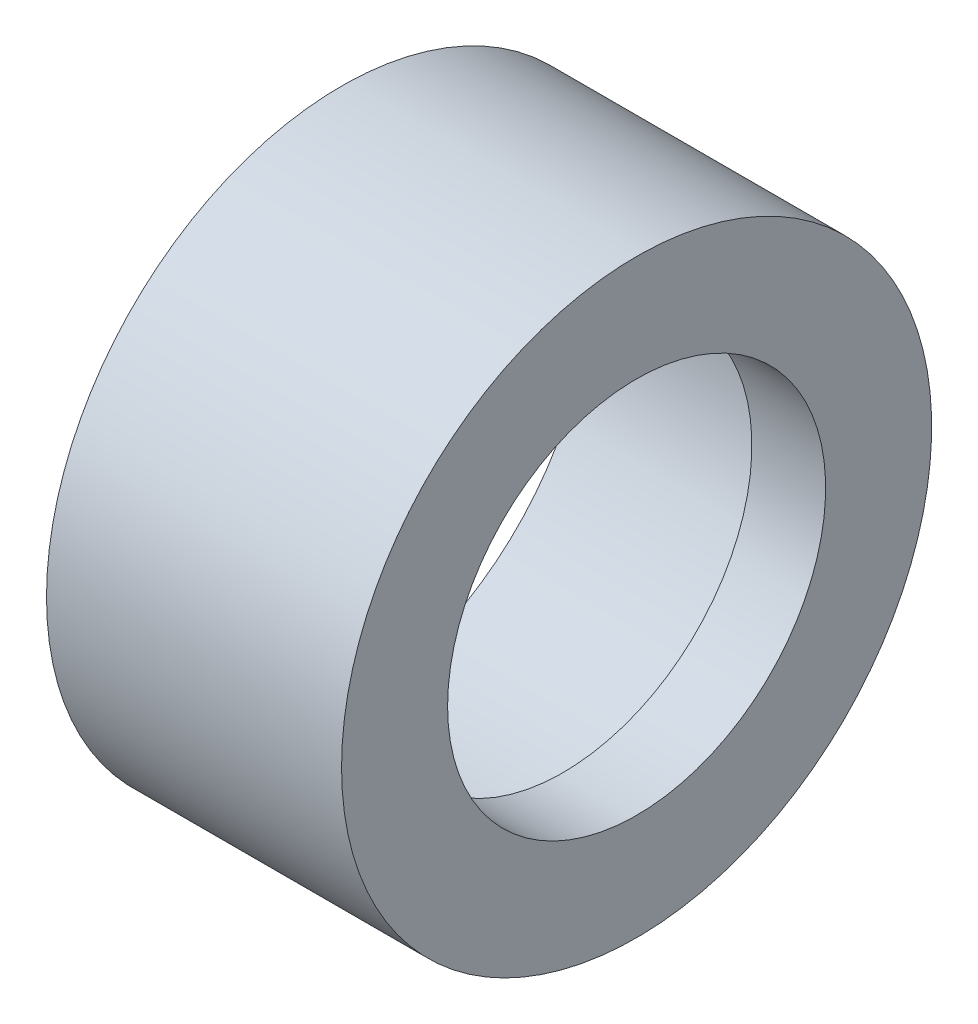
ISO-10303-21;
HEADER;
FILE_DESCRIPTION(('STEP AP214'),'2;1');
FILE_NAME('part.step','',(''),(''),'','','');
FILE_SCHEMA(('AUTOMOTIVE_DESIGN { 1 0 10303 214 1 1 1 1 }'));
ENDSEC;
DATA;
#1=APPLICATION_CONTEXT('core data for automotive mechanical design processes');
#2=APPLICATION_PROTOCOL_DEFINITION('international standard','automotive_design',2000,#1);
#3=PRODUCT_CONTEXT('',#1,'mechanical');
#4=PRODUCT('Part','Part','',(#3));
#5=PRODUCT_RELATED_PRODUCT_CATEGORY('part','',(#4));
#6=PRODUCT_DEFINITION_FORMATION('','',#4);
#7=PRODUCT_DEFINITION_CONTEXT('part definition',#1,'design');
#8=PRODUCT_DEFINITION('design','',#6,#7);
#9=PRODUCT_DEFINITION_SHAPE('','',#8);
#10=(LENGTH_UNIT() NAMED_UNIT(*) SI_UNIT(.MILLI.,.METRE.));
#11=(NAMED_UNIT(*) PLANE_ANGLE_UNIT() SI_UNIT($,.RADIAN.));
#12=(NAMED_UNIT(*) SI_UNIT($,.STERADIAN.) SOLID_ANGLE_UNIT());
#13=UNCERTAINTY_MEASURE_WITH_UNIT(LENGTH_MEASURE(1.E-05),#10,'distance_accuracy_value','');
#14=(GEOMETRIC_REPRESENTATION_CONTEXT(3) GLOBAL_UNCERTAINTY_ASSIGNED_CONTEXT((#13)) GLOBAL_UNIT_ASSIGNED_CONTEXT((#10,
#11,#12)) REPRESENTATION_CONTEXT('',''));
#15=CARTESIAN_POINT('',(0.,0.,0.));
#16=DIRECTION('',(0.,0.,1.));
#17=DIRECTION('',(1.,0.,0.));
#18=AXIS2_PLACEMENT_3D('',#15,#16,#17);
#19=CARTESIAN_POINT('',(0.,4.,0.));
#20=DIRECTION('',(1.,0.,0.));
#21=DIRECTION('',(0.,0.,-1.));
#22=AXIS2_PLACEMENT_3D('',#19,#20,#21);
#23=PLANE('',#22);
#24=CARTESIAN_POINT('',(0.,0.,0.));
#25=DIRECTION('',(-1.,0.,0.));
#26=DIRECTION('',(0.,0.,1.));
#27=AXIS2_PLACEMENT_3D('',#24,#25,#26);
#28=CIRCLE('',#27,3.3625);
#29=CARTESIAN_POINT('',(0.,0.,3.3625));
#30=VERTEX_POINT('',#29);
#31=EDGE_CURVE('E10',#30,#30,#28,.T.);
#32=ORIENTED_EDGE('',*,*,#31,.F.);
#33=EDGE_LOOP('',(#32));
#34=FACE_BOUND('',#33,.T.);
#35=CARTESIAN_POINT('',(0.,0.,0.));
#36=DIRECTION('',(-1.,0.,0.));
#37=DIRECTION('',(0.,0.,1.));
#38=AXIS2_PLACEMENT_3D('',#35,#36,#37);
#39=CIRCLE('',#38,4.);
#40=CARTESIAN_POINT('',(0.,0.,4.));
#41=VERTEX_POINT('',#40);
#42=EDGE_CURVE('E64',#41,#41,#39,.T.);
#43=ORIENTED_EDGE('',*,*,#42,.T.);
#44=EDGE_LOOP('',(#43));
#45=FACE_BOUND('',#44,.T.);
#46=ADVANCED_FACE('F37',(#34,#45),#23,.F.);
#47=CARTESIAN_POINT('',(0.,0.,0.));
#48=DIRECTION('',(-1.,0.,0.));
#49=DIRECTION('',(0.,0.,1.));
#50=AXIS2_PLACEMENT_3D('',#47,#48,#49);
#51=CYLINDRICAL_SURFACE('',#50,3.3625);
#52=CARTESIAN_POINT('',(3.,0.,0.));
#53=DIRECTION('',(-1.,0.,0.));
#54=DIRECTION('',(0.,0.,1.));
#55=AXIS2_PLACEMENT_3D('',#52,#53,#54);
#56=CIRCLE('',#55,3.3625);
#57=CARTESIAN_POINT('',(3.,0.,3.3625));
#58=VERTEX_POINT('',#57);
#59=EDGE_CURVE('E44',#58,#58,#56,.T.);
#60=ORIENTED_EDGE('',*,*,#59,.F.);
#61=EDGE_LOOP('',(#60));
#62=FACE_BOUND('',#61,.T.);
#63=ORIENTED_EDGE('',*,*,#31,.T.);
#64=EDGE_LOOP('',(#63));
#65=FACE_BOUND('',#64,.T.);
#66=ADVANCED_FACE('F90',(#62,#65),#51,.F.);
#67=CARTESIAN_POINT('',(3.,3.3625,0.));
#68=DIRECTION('',(1.,0.,0.));
#69=DIRECTION('',(0.,0.,-1.));
#70=AXIS2_PLACEMENT_3D('',#67,#68,#69);
#71=PLANE('',#70);
#72=CARTESIAN_POINT('',(3.,0.,0.));
#73=DIRECTION('',(-1.,0.,0.));
#74=DIRECTION('',(0.,0.,1.));
#75=AXIS2_PLACEMENT_3D('',#72,#73,#74);
#76=CIRCLE('',#75,2.5625);
#77=CARTESIAN_POINT('',(3.,0.,2.5625));
#78=VERTEX_POINT('',#77);
#79=EDGE_CURVE('E49',#78,#78,#76,.T.);
#80=ORIENTED_EDGE('',*,*,#79,.F.);
#81=EDGE_LOOP('',(#80));
#82=FACE_BOUND('',#81,.T.);
#83=ORIENTED_EDGE('',*,*,#59,.T.);
#84=EDGE_LOOP('',(#83));
#85=FACE_BOUND('',#84,.T.);
#86=ADVANCED_FACE('F85',(#82,#85),#71,.F.);
#87=CARTESIAN_POINT('',(0.,0.,0.));
#88=DIRECTION('',(-1.,0.,0.));
#89=DIRECTION('',(0.,0.,1.));
#90=AXIS2_PLACEMENT_3D('',#87,#88,#89);
#91=CYLINDRICAL_SURFACE('',#90,2.5625);
#92=CARTESIAN_POINT('',(4.,0.,0.));
#93=DIRECTION('',(-1.,0.,0.));
#94=DIRECTION('',(0.,0.,1.));
#95=AXIS2_PLACEMENT_3D('',#92,#93,#94);
#96=CIRCLE('',#95,2.5625);
#97=CARTESIAN_POINT('',(4.,0.,2.5625));
#98=VERTEX_POINT('',#97);
#99=EDGE_CURVE('E54',#98,#98,#96,.T.);
#100=ORIENTED_EDGE('',*,*,#99,.F.);
#101=EDGE_LOOP('',(#100));
#102=FACE_BOUND('',#101,.T.);
#103=ORIENTED_EDGE('',*,*,#79,.T.);
#104=EDGE_LOOP('',(#103));
#105=FACE_BOUND('',#104,.T.);
#106=ADVANCED_FACE('F79',(#102,#105),#91,.F.);
#107=CARTESIAN_POINT('',(4.,2.5625,0.));
#108=DIRECTION('',(-1.,0.,0.));
#109=DIRECTION('',(0.,0.,1.));
#110=AXIS2_PLACEMENT_3D('',#107,#108,#109);
#111=PLANE('',#110);
#112=CARTESIAN_POINT('',(4.,0.,0.));
#113=DIRECTION('',(-1.,0.,0.));
#114=DIRECTION('',(0.,0.,1.));
#115=AXIS2_PLACEMENT_3D('',#112,#113,#114);
#116=CIRCLE('',#115,4.);
#117=CARTESIAN_POINT('',(4.,0.,4.));
#118=VERTEX_POINT('',#117);
#119=EDGE_CURVE('E60',#118,#118,#116,.T.);
#120=ORIENTED_EDGE('',*,*,#119,.F.);
#121=EDGE_LOOP('',(#120));
#122=FACE_BOUND('',#121,.T.);
#123=ORIENTED_EDGE('',*,*,#99,.T.);
#124=EDGE_LOOP('',(#123));
#125=FACE_BOUND('',#124,.T.);
#126=ADVANCED_FACE('F73',(#122,#125),#111,.F.);
#127=CARTESIAN_POINT('',(0.,0.,0.));
#128=DIRECTION('',(-1.,0.,0.));
#129=DIRECTION('',(0.,0.,1.));
#130=AXIS2_PLACEMENT_3D('',#127,#128,#129);
#131=CYLINDRICAL_SURFACE('',#130,4.);
#132=ORIENTED_EDGE('',*,*,#42,.F.);
#133=EDGE_LOOP('',(#132));
#134=FACE_BOUND('',#133,.T.);
#135=ORIENTED_EDGE('',*,*,#119,.T.);
#136=EDGE_LOOP('',(#135));
#137=FACE_BOUND('',#136,.T.);
#138=ADVANCED_FACE('F70',(#134,#137),#131,.T.);
#139=CLOSED_SHELL('',(#46,#66,#86,#106,#126,#138));
#140=MANIFOLD_SOLID_BREP('B2',#139);
#141=ADVANCED_BREP_SHAPE_REPRESENTATION('',(#18,#140),#14);
#142=SHAPE_DEFINITION_REPRESENTATION(#9,#141);
ENDSEC;
END-ISO-10303-21;
